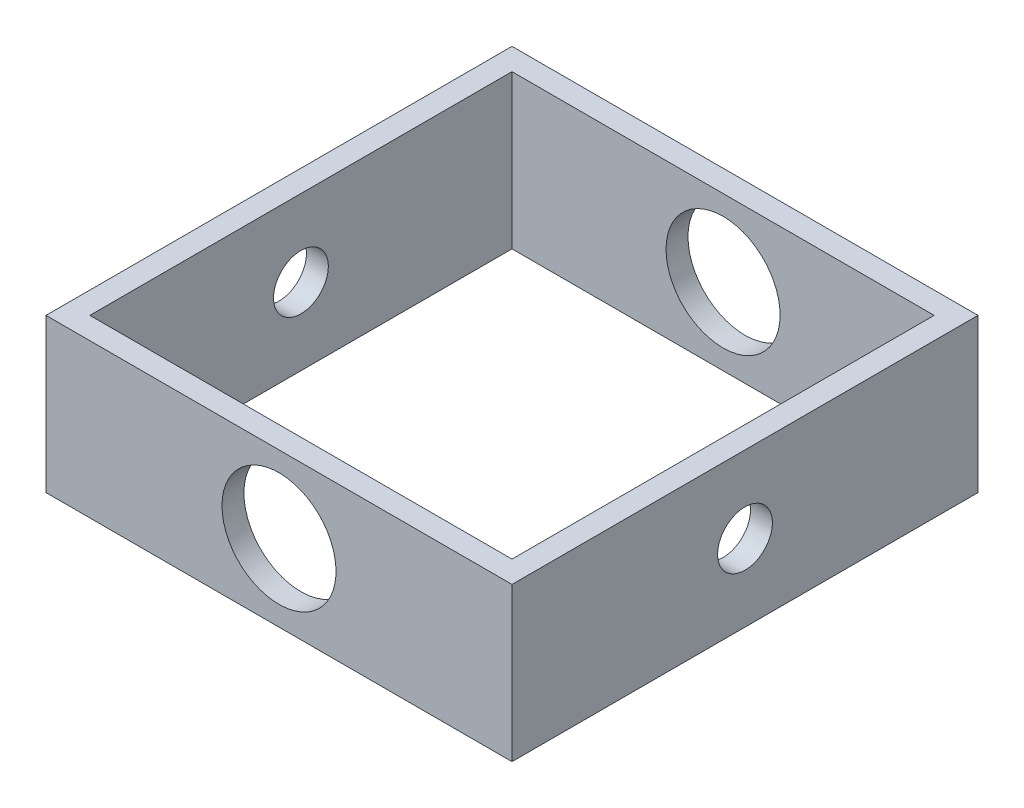
ISO-10303-21;
HEADER;
FILE_DESCRIPTION(('STEP AP214'),'2;1');
FILE_NAME('part.step','',(''),(''),'','','');
FILE_SCHEMA(('AUTOMOTIVE_DESIGN { 1 0 10303 214 1 1 1 1 }'));
ENDSEC;
DATA;
#1=APPLICATION_CONTEXT('core data for automotive mechanical design processes');
#2=APPLICATION_PROTOCOL_DEFINITION('international standard','automotive_design',2000,#1);
#3=PRODUCT_CONTEXT('',#1,'mechanical');
#4=PRODUCT('Part','Part','',(#3));
#5=PRODUCT_RELATED_PRODUCT_CATEGORY('part','',(#4));
#6=PRODUCT_DEFINITION_FORMATION('','',#4);
#7=PRODUCT_DEFINITION_CONTEXT('part definition',#1,'design');
#8=PRODUCT_DEFINITION('design','',#6,#7);
#9=PRODUCT_DEFINITION_SHAPE('','',#8);
#10=(LENGTH_UNIT() NAMED_UNIT(*) SI_UNIT(.MILLI.,.METRE.));
#11=(NAMED_UNIT(*) PLANE_ANGLE_UNIT() SI_UNIT($,.RADIAN.));
#12=(NAMED_UNIT(*) SI_UNIT($,.STERADIAN.) SOLID_ANGLE_UNIT());
#13=UNCERTAINTY_MEASURE_WITH_UNIT(LENGTH_MEASURE(1.E-05),#10,'distance_accuracy_value','');
#14=(GEOMETRIC_REPRESENTATION_CONTEXT(3) GLOBAL_UNCERTAINTY_ASSIGNED_CONTEXT((#13)) GLOBAL_UNIT_ASSIGNED_CONTEXT((#10,
#11,#12)) REPRESENTATION_CONTEXT('',''));
#15=CARTESIAN_POINT('',(0.,0.,0.));
#16=DIRECTION('',(0.,0.,1.));
#17=DIRECTION('',(1.,0.,0.));
#18=AXIS2_PLACEMENT_3D('',#15,#16,#17);
#19=CARTESIAN_POINT('',(0.,8.89,0.));
#20=DIRECTION('',(0.,1.,0.));
#21=DIRECTION('',(0.,0.,1.));
#22=AXIS2_PLACEMENT_3D('',#19,#20,#21);
#23=PLANE('',#22);
#24=DIRECTION('',(0.,0.,-1.));
#25=VECTOR('',#24,1.);
#26=CARTESIAN_POINT('',(13.49375,8.89,-13.49375));
#27=LINE('',#26,#25);
#28=CARTESIAN_POINT('',(13.49375,8.89,13.49375));
#29=VERTEX_POINT('',#28);
#30=CARTESIAN_POINT('',(13.49375,8.89,-13.49375));
#31=VERTEX_POINT('',#30);
#32=EDGE_CURVE('E138',#29,#31,#27,.T.);
#33=ORIENTED_EDGE('',*,*,#32,.T.);
#34=DIRECTION('',(-1.,0.,0.));
#35=VECTOR('',#34,1.);
#36=CARTESIAN_POINT('',(-13.49375,8.89,-13.49375));
#37=LINE('',#36,#35);
#38=CARTESIAN_POINT('',(-13.49375,8.89,-13.49375));
#39=VERTEX_POINT('',#38);
#40=EDGE_CURVE('E141',#31,#39,#37,.T.);
#41=ORIENTED_EDGE('',*,*,#40,.T.);
#42=DIRECTION('',(0.,0.,1.));
#43=VECTOR('',#42,1.);
#44=CARTESIAN_POINT('',(-13.49375,8.89,-13.49375));
#45=LINE('',#44,#43);
#46=CARTESIAN_POINT('',(-13.49375,8.89,13.49375));
#47=VERTEX_POINT('',#46);
#48=EDGE_CURVE('E144',#39,#47,#45,.T.);
#49=ORIENTED_EDGE('',*,*,#48,.T.);
#50=DIRECTION('',(1.,0.,0.));
#51=VECTOR('',#50,1.);
#52=CARTESIAN_POINT('',(-13.49375,8.89,13.49375));
#53=LINE('',#52,#51);
#54=EDGE_CURVE('E146',#47,#29,#53,.T.);
#55=ORIENTED_EDGE('',*,*,#54,.T.);
#56=EDGE_LOOP('',(#33,#41,#49,#55));
#57=FACE_BOUND('',#56,.T.);
#58=DIRECTION('',(-1.,0.,0.));
#59=VECTOR('',#58,1.);
#60=CARTESIAN_POINT('',(-12.22375,8.89,-12.22375));
#61=LINE('',#60,#59);
#62=CARTESIAN_POINT('',(12.22375,8.89,-12.22375));
#63=VERTEX_POINT('',#62);
#64=CARTESIAN_POINT('',(-12.22375,8.89,-12.22375));
#65=VERTEX_POINT('',#64);
#66=EDGE_CURVE('E108',#63,#65,#61,.T.);
#67=ORIENTED_EDGE('',*,*,#66,.F.);
#68=DIRECTION('',(0.,0.,-1.));
#69=VECTOR('',#68,1.);
#70=CARTESIAN_POINT('',(12.22375,8.89,-12.22375));
#71=LINE('',#70,#69);
#72=CARTESIAN_POINT('',(12.22375,8.89,12.22375));
#73=VERTEX_POINT('',#72);
#74=EDGE_CURVE('E100',#73,#63,#71,.T.);
#75=ORIENTED_EDGE('',*,*,#74,.F.);
#76=DIRECTION('',(1.,0.,0.));
#77=VECTOR('',#76,1.);
#78=CARTESIAN_POINT('',(-12.22375,8.89,12.22375));
#79=LINE('',#78,#77);
#80=CARTESIAN_POINT('',(-12.22375,8.89,12.22375));
#81=VERTEX_POINT('',#80);
#82=EDGE_CURVE('E122',#81,#73,#79,.T.);
#83=ORIENTED_EDGE('',*,*,#82,.F.);
#84=DIRECTION('',(0.,0.,1.));
#85=VECTOR('',#84,1.);
#86=CARTESIAN_POINT('',(-12.22375,8.89,-12.22375));
#87=LINE('',#86,#85);
#88=EDGE_CURVE('E120',#65,#81,#87,.T.);
#89=ORIENTED_EDGE('',*,*,#88,.F.);
#90=EDGE_LOOP('',(#67,#75,#83,#89));
#91=FACE_BOUND('',#90,.T.);
#92=ADVANCED_FACE('F33',(#57,#91),#23,.T.);
#93=CARTESIAN_POINT('',(0.,0.,0.));
#94=DIRECTION('',(0.,1.,0.));
#95=DIRECTION('',(0.,0.,1.));
#96=AXIS2_PLACEMENT_3D('',#93,#94,#95);
#97=PLANE('',#96);
#98=DIRECTION('',(0.,0.,-1.));
#99=VECTOR('',#98,1.);
#100=CARTESIAN_POINT('',(13.49375,0.,-13.49375));
#101=LINE('',#100,#99);
#102=CARTESIAN_POINT('',(13.49375,0.,13.49375));
#103=VERTEX_POINT('',#102);
#104=CARTESIAN_POINT('',(13.49375,0.,-13.49375));
#105=VERTEX_POINT('',#104);
#106=EDGE_CURVE('E116',#103,#105,#101,.T.);
#107=ORIENTED_EDGE('',*,*,#106,.F.);
#108=DIRECTION('',(1.,0.,0.));
#109=VECTOR('',#108,1.);
#110=CARTESIAN_POINT('',(-13.49375,0.,13.49375));
#111=LINE('',#110,#109);
#112=CARTESIAN_POINT('',(-13.49375,0.,13.49375));
#113=VERTEX_POINT('',#112);
#114=EDGE_CURVE('E142',#113,#103,#111,.T.);
#115=ORIENTED_EDGE('',*,*,#114,.F.);
#116=DIRECTION('',(0.,0.,1.));
#117=VECTOR('',#116,1.);
#118=CARTESIAN_POINT('',(-13.49375,0.,-13.49375));
#119=LINE('',#118,#117);
#120=CARTESIAN_POINT('',(-13.49375,0.,-13.49375));
#121=VERTEX_POINT('',#120);
#122=EDGE_CURVE('E153',#121,#113,#119,.T.);
#123=ORIENTED_EDGE('',*,*,#122,.F.);
#124=DIRECTION('',(-1.,0.,0.));
#125=VECTOR('',#124,1.);
#126=CARTESIAN_POINT('',(-13.49375,0.,-13.49375));
#127=LINE('',#126,#125);
#128=EDGE_CURVE('E151',#105,#121,#127,.T.);
#129=ORIENTED_EDGE('',*,*,#128,.F.);
#130=EDGE_LOOP('',(#107,#115,#123,#129));
#131=FACE_BOUND('',#130,.T.);
#132=DIRECTION('',(0.,0.,-1.));
#133=VECTOR('',#132,1.);
#134=CARTESIAN_POINT('',(12.22375,0.,-12.22375));
#135=LINE('',#134,#133);
#136=CARTESIAN_POINT('',(12.22375,0.,12.22375));
#137=VERTEX_POINT('',#136);
#138=CARTESIAN_POINT('',(12.22375,0.,-12.22375));
#139=VERTEX_POINT('',#138);
#140=EDGE_CURVE('E58',#137,#139,#135,.T.);
#141=ORIENTED_EDGE('',*,*,#140,.T.);
#142=DIRECTION('',(-1.,0.,0.));
#143=VECTOR('',#142,1.);
#144=CARTESIAN_POINT('',(-12.22375,0.,-12.22375));
#145=LINE('',#144,#143);
#146=CARTESIAN_POINT('',(-12.22375,0.,-12.22375));
#147=VERTEX_POINT('',#146);
#148=EDGE_CURVE('E115',#139,#147,#145,.T.);
#149=ORIENTED_EDGE('',*,*,#148,.T.);
#150=DIRECTION('',(0.,0.,1.));
#151=VECTOR('',#150,1.);
#152=CARTESIAN_POINT('',(-12.22375,0.,-12.22375));
#153=LINE('',#152,#151);
#154=CARTESIAN_POINT('',(-12.22375,0.,12.22375));
#155=VERTEX_POINT('',#154);
#156=EDGE_CURVE('E130',#147,#155,#153,.T.);
#157=ORIENTED_EDGE('',*,*,#156,.T.);
#158=DIRECTION('',(1.,0.,0.));
#159=VECTOR('',#158,1.);
#160=CARTESIAN_POINT('',(-12.22375,0.,12.22375));
#161=LINE('',#160,#159);
#162=EDGE_CURVE('E109',#155,#137,#161,.T.);
#163=ORIENTED_EDGE('',*,*,#162,.T.);
#164=EDGE_LOOP('',(#141,#149,#157,#163));
#165=FACE_BOUND('',#164,.T.);
#166=ADVANCED_FACE('F201',(#131,#165),#97,.F.);
#167=CARTESIAN_POINT('',(13.49375,8.89,-13.49375));
#168=DIRECTION('',(-1.,0.,0.));
#169=DIRECTION('',(0.,0.,1.));
#170=AXIS2_PLACEMENT_3D('',#167,#168,#169);
#171=PLANE('',#170);
#172=CARTESIAN_POINT('',(13.49375,4.445,0.));
#173=DIRECTION('',(1.,0.,0.));
#174=DIRECTION('',(0.,0.,-1.));
#175=AXIS2_PLACEMENT_3D('',#172,#173,#174);
#176=CIRCLE('',#175,1.5875);
#177=CARTESIAN_POINT('',(13.49375,4.445,-1.5875));
#178=VERTEX_POINT('',#177);
#179=EDGE_CURVE('E165',#178,#178,#176,.T.);
#180=ORIENTED_EDGE('',*,*,#179,.F.);
#181=EDGE_LOOP('',(#180));
#182=FACE_BOUND('',#181,.T.);
#183=ORIENTED_EDGE('',*,*,#106,.T.);
#184=DIRECTION('',(0.,-1.,0.));
#185=VECTOR('',#184,1.);
#186=CARTESIAN_POINT('',(13.49375,8.89,-13.49375));
#187=LINE('',#186,#185);
#188=EDGE_CURVE('E11',#31,#105,#187,.T.);
#189=ORIENTED_EDGE('',*,*,#188,.F.);
#190=ORIENTED_EDGE('',*,*,#32,.F.);
#191=DIRECTION('',(0.,-1.,0.));
#192=VECTOR('',#191,1.);
#193=CARTESIAN_POINT('',(13.49375,8.89,13.49375));
#194=LINE('',#193,#192);
#195=EDGE_CURVE('E148',#29,#103,#194,.T.);
#196=ORIENTED_EDGE('',*,*,#195,.T.);
#197=EDGE_LOOP('',(#183,#189,#190,#196));
#198=FACE_BOUND('',#197,.T.);
#199=ADVANCED_FACE('F35',(#182,#198),#171,.F.);
#200=CARTESIAN_POINT('',(-13.49375,8.89,-13.49375));
#201=DIRECTION('',(0.,0.,1.));
#202=DIRECTION('',(1.,0.,0.));
#203=AXIS2_PLACEMENT_3D('',#200,#201,#202);
#204=PLANE('',#203);
#205=CARTESIAN_POINT('',(0.,4.445,-13.49375));
#206=DIRECTION('',(0.,0.,-1.));
#207=DIRECTION('',(-1.,0.,0.));
#208=AXIS2_PLACEMENT_3D('',#205,#206,#207);
#209=CIRCLE('',#208,3.302);
#210=CARTESIAN_POINT('',(-3.302,4.445,-13.49375));
#211=VERTEX_POINT('',#210);
#212=EDGE_CURVE('E227',#211,#211,#209,.T.);
#213=ORIENTED_EDGE('',*,*,#212,.F.);
#214=EDGE_LOOP('',(#213));
#215=FACE_BOUND('',#214,.T.);
#216=ORIENTED_EDGE('',*,*,#128,.T.);
#217=DIRECTION('',(0.,-1.,0.));
#218=VECTOR('',#217,1.);
#219=CARTESIAN_POINT('',(-13.49375,8.89,-13.49375));
#220=LINE('',#219,#218);
#221=EDGE_CURVE('E42',#39,#121,#220,.T.);
#222=ORIENTED_EDGE('',*,*,#221,.F.);
#223=ORIENTED_EDGE('',*,*,#40,.F.);
#224=ORIENTED_EDGE('',*,*,#188,.T.);
#225=EDGE_LOOP('',(#216,#222,#223,#224));
#226=FACE_BOUND('',#225,.T.);
#227=ADVANCED_FACE('F217',(#215,#226),#204,.F.);
#228=CARTESIAN_POINT('',(-13.49375,8.89,-13.49375));
#229=DIRECTION('',(1.,0.,0.));
#230=DIRECTION('',(0.,0.,-1.));
#231=AXIS2_PLACEMENT_3D('',#228,#229,#230);
#232=PLANE('',#231);
#233=CARTESIAN_POINT('',(-13.49375,4.445,0.));
#234=DIRECTION('',(1.,0.,0.));
#235=DIRECTION('',(0.,0.,-1.));
#236=AXIS2_PLACEMENT_3D('',#233,#234,#235);
#237=CIRCLE('',#236,1.5875);
#238=CARTESIAN_POINT('',(-13.49375,4.445,-1.5875));
#239=VERTEX_POINT('',#238);
#240=EDGE_CURVE('E128',#239,#239,#237,.T.);
#241=ORIENTED_EDGE('',*,*,#240,.T.);
#242=EDGE_LOOP('',(#241));
#243=FACE_BOUND('',#242,.T.);
#244=ORIENTED_EDGE('',*,*,#122,.T.);
#245=DIRECTION('',(0.,-1.,0.));
#246=VECTOR('',#245,1.);
#247=CARTESIAN_POINT('',(-13.49375,8.89,13.49375));
#248=LINE('',#247,#246);
#249=EDGE_CURVE('E158',#47,#113,#248,.T.);
#250=ORIENTED_EDGE('',*,*,#249,.F.);
#251=ORIENTED_EDGE('',*,*,#48,.F.);
#252=ORIENTED_EDGE('',*,*,#221,.T.);
#253=EDGE_LOOP('',(#244,#250,#251,#252));
#254=FACE_BOUND('',#253,.T.);
#255=ADVANCED_FACE('F182',(#243,#254),#232,.F.);
#256=CARTESIAN_POINT('',(-13.49375,8.89,13.49375));
#257=DIRECTION('',(0.,0.,-1.));
#258=DIRECTION('',(-1.,0.,0.));
#259=AXIS2_PLACEMENT_3D('',#256,#257,#258);
#260=PLANE('',#259);
#261=CARTESIAN_POINT('',(0.,4.445,13.49375));
#262=DIRECTION('',(0.,0.,-1.));
#263=DIRECTION('',(-1.,0.,0.));
#264=AXIS2_PLACEMENT_3D('',#261,#262,#263);
#265=CIRCLE('',#264,3.302);
#266=CARTESIAN_POINT('',(-3.302,4.445,13.49375));
#267=VERTEX_POINT('',#266);
#268=EDGE_CURVE('E171',#267,#267,#265,.T.);
#269=ORIENTED_EDGE('',*,*,#268,.T.);
#270=EDGE_LOOP('',(#269));
#271=FACE_BOUND('',#270,.T.);
#272=ORIENTED_EDGE('',*,*,#114,.T.);
#273=ORIENTED_EDGE('',*,*,#195,.F.);
#274=ORIENTED_EDGE('',*,*,#54,.F.);
#275=ORIENTED_EDGE('',*,*,#249,.T.);
#276=EDGE_LOOP('',(#272,#273,#274,#275));
#277=FACE_BOUND('',#276,.T.);
#278=ADVANCED_FACE('F212',(#271,#277),#260,.F.);
#279=CARTESIAN_POINT('',(12.22375,8.89,-12.22375));
#280=DIRECTION('',(-1.,0.,0.));
#281=DIRECTION('',(0.,0.,1.));
#282=AXIS2_PLACEMENT_3D('',#279,#280,#281);
#283=PLANE('',#282);
#284=CARTESIAN_POINT('',(12.22375,4.445,0.));
#285=DIRECTION('',(-1.,0.,0.));
#286=DIRECTION('',(0.,0.,1.));
#287=AXIS2_PLACEMENT_3D('',#284,#285,#286);
#288=CIRCLE('',#287,1.5875);
#289=CARTESIAN_POINT('',(12.22375,4.445,1.5875));
#290=VERTEX_POINT('',#289);
#291=EDGE_CURVE('E164',#290,#290,#288,.T.);
#292=ORIENTED_EDGE('',*,*,#291,.F.);
#293=EDGE_LOOP('',(#292));
#294=FACE_BOUND('',#293,.T.);
#295=ORIENTED_EDGE('',*,*,#140,.F.);
#296=DIRECTION('',(0.,-1.,0.));
#297=VECTOR('',#296,1.);
#298=CARTESIAN_POINT('',(12.22375,8.89,12.22375));
#299=LINE('',#298,#297);
#300=EDGE_CURVE('E104',#73,#137,#299,.T.);
#301=ORIENTED_EDGE('',*,*,#300,.F.);
#302=ORIENTED_EDGE('',*,*,#74,.T.);
#303=DIRECTION('',(0.,-1.,0.));
#304=VECTOR('',#303,1.);
#305=CARTESIAN_POINT('',(12.22375,8.89,-12.22375));
#306=LINE('',#305,#304);
#307=EDGE_CURVE('E103',#63,#139,#306,.T.);
#308=ORIENTED_EDGE('',*,*,#307,.T.);
#309=EDGE_LOOP('',(#295,#301,#302,#308));
#310=FACE_BOUND('',#309,.T.);
#311=ADVANCED_FACE('F102',(#294,#310),#283,.T.);
#312=CARTESIAN_POINT('',(-12.22375,8.89,-12.22375));
#313=DIRECTION('',(0.,0.,1.));
#314=DIRECTION('',(1.,0.,0.));
#315=AXIS2_PLACEMENT_3D('',#312,#313,#314);
#316=PLANE('',#315);
#317=CARTESIAN_POINT('',(0.,4.445,-12.22375));
#318=DIRECTION('',(0.,0.,1.));
#319=DIRECTION('',(1.,0.,0.));
#320=AXIS2_PLACEMENT_3D('',#317,#318,#319);
#321=CIRCLE('',#320,3.302);
#322=CARTESIAN_POINT('',(3.302,4.445,-12.22375));
#323=VERTEX_POINT('',#322);
#324=EDGE_CURVE('E176',#323,#323,#321,.T.);
#325=ORIENTED_EDGE('',*,*,#324,.F.);
#326=EDGE_LOOP('',(#325));
#327=FACE_BOUND('',#326,.T.);
#328=ORIENTED_EDGE('',*,*,#148,.F.);
#329=ORIENTED_EDGE('',*,*,#307,.F.);
#330=ORIENTED_EDGE('',*,*,#66,.T.);
#331=DIRECTION('',(0.,-1.,0.));
#332=VECTOR('',#331,1.);
#333=CARTESIAN_POINT('',(-12.22375,8.89,-12.22375));
#334=LINE('',#333,#332);
#335=EDGE_CURVE('E117',#65,#147,#334,.T.);
#336=ORIENTED_EDGE('',*,*,#335,.T.);
#337=EDGE_LOOP('',(#328,#329,#330,#336));
#338=FACE_BOUND('',#337,.T.);
#339=ADVANCED_FACE('F112',(#327,#338),#316,.T.);
#340=CARTESIAN_POINT('',(-12.22375,8.89,-12.22375));
#341=DIRECTION('',(1.,0.,0.));
#342=DIRECTION('',(0.,0.,-1.));
#343=AXIS2_PLACEMENT_3D('',#340,#341,#342);
#344=PLANE('',#343);
#345=CARTESIAN_POINT('',(-12.22375,4.445,0.));
#346=DIRECTION('',(1.,0.,0.));
#347=DIRECTION('',(0.,0.,-1.));
#348=AXIS2_PLACEMENT_3D('',#345,#346,#347);
#349=CIRCLE('',#348,1.5875);
#350=CARTESIAN_POINT('',(-12.22375,4.445,-1.5875));
#351=VERTEX_POINT('',#350);
#352=EDGE_CURVE('E162',#351,#351,#349,.T.);
#353=ORIENTED_EDGE('',*,*,#352,.F.);
#354=EDGE_LOOP('',(#353));
#355=FACE_BOUND('',#354,.T.);
#356=ORIENTED_EDGE('',*,*,#156,.F.);
#357=ORIENTED_EDGE('',*,*,#335,.F.);
#358=ORIENTED_EDGE('',*,*,#88,.T.);
#359=DIRECTION('',(0.,-1.,0.));
#360=VECTOR('',#359,1.);
#361=CARTESIAN_POINT('',(-12.22375,8.89,12.22375));
#362=LINE('',#361,#360);
#363=EDGE_CURVE('E50',#81,#155,#362,.T.);
#364=ORIENTED_EDGE('',*,*,#363,.T.);
#365=EDGE_LOOP('',(#356,#357,#358,#364));
#366=FACE_BOUND('',#365,.T.);
#367=ADVANCED_FACE('F196',(#355,#366),#344,.T.);
#368=CARTESIAN_POINT('',(-12.22375,8.89,12.22375));
#369=DIRECTION('',(0.,0.,-1.));
#370=DIRECTION('',(-1.,0.,0.));
#371=AXIS2_PLACEMENT_3D('',#368,#369,#370);
#372=PLANE('',#371);
#373=CARTESIAN_POINT('',(0.,4.445,12.22375));
#374=DIRECTION('',(0.,0.,-1.));
#375=DIRECTION('',(-1.,0.,0.));
#376=AXIS2_PLACEMENT_3D('',#373,#374,#375);
#377=CIRCLE('',#376,3.302);
#378=CARTESIAN_POINT('',(-3.302,4.445,12.22375));
#379=VERTEX_POINT('',#378);
#380=EDGE_CURVE('E37',#379,#379,#377,.T.);
#381=ORIENTED_EDGE('',*,*,#380,.F.);
#382=EDGE_LOOP('',(#381));
#383=FACE_BOUND('',#382,.T.);
#384=ORIENTED_EDGE('',*,*,#162,.F.);
#385=ORIENTED_EDGE('',*,*,#363,.F.);
#386=ORIENTED_EDGE('',*,*,#82,.T.);
#387=ORIENTED_EDGE('',*,*,#300,.T.);
#388=EDGE_LOOP('',(#384,#385,#386,#387));
#389=FACE_BOUND('',#388,.T.);
#390=ADVANCED_FACE('F188',(#383,#389),#372,.T.);
#391=CARTESIAN_POINT('',(-138.90625,4.445,0.));
#392=DIRECTION('',(1.,0.,0.));
#393=DIRECTION('',(0.,0.,-1.));
#394=AXIS2_PLACEMENT_3D('',#391,#392,#393);
#395=CYLINDRICAL_SURFACE('',#394,1.5875);
#396=ORIENTED_EDGE('',*,*,#352,.T.);
#397=EDGE_LOOP('',(#396));
#398=FACE_BOUND('',#397,.T.);
#399=ORIENTED_EDGE('',*,*,#240,.F.);
#400=EDGE_LOOP('',(#399));
#401=FACE_BOUND('',#400,.T.);
#402=ADVANCED_FACE('F185',(#398,#401),#395,.F.);
#403=ORIENTED_EDGE('',*,*,#291,.T.);
#404=EDGE_LOOP('',(#403));
#405=FACE_BOUND('',#404,.T.);
#406=ORIENTED_EDGE('',*,*,#179,.T.);
#407=EDGE_LOOP('',(#406));
#408=FACE_BOUND('',#407,.T.);
#409=ADVANCED_FACE('F187',(#405,#408),#395,.F.);
#410=CARTESIAN_POINT('',(0.,4.445,138.90625));
#411=DIRECTION('',(0.,0.,-1.));
#412=DIRECTION('',(-1.,0.,0.));
#413=AXIS2_PLACEMENT_3D('',#410,#411,#412);
#414=CYLINDRICAL_SURFACE('',#413,3.302);
#415=ORIENTED_EDGE('',*,*,#380,.T.);
#416=EDGE_LOOP('',(#415));
#417=FACE_BOUND('',#416,.T.);
#418=ORIENTED_EDGE('',*,*,#268,.F.);
#419=EDGE_LOOP('',(#418));
#420=FACE_BOUND('',#419,.T.);
#421=ADVANCED_FACE('F194',(#417,#420),#414,.F.);
#422=ORIENTED_EDGE('',*,*,#324,.T.);
#423=EDGE_LOOP('',(#422));
#424=FACE_BOUND('',#423,.T.);
#425=ORIENTED_EDGE('',*,*,#212,.T.);
#426=EDGE_LOOP('',(#425));
#427=FACE_BOUND('',#426,.T.);
#428=ADVANCED_FACE('F260',(#424,#427),#414,.F.);
#429=CLOSED_SHELL('',(#92,#166,#199,#227,#255,#278,#311,#339,#367,#390,#402,#409,#421,#428));
#430=MANIFOLD_SOLID_BREP('B2',#429);
#431=ADVANCED_BREP_SHAPE_REPRESENTATION('',(#18,#430),#14);
#432=SHAPE_DEFINITION_REPRESENTATION(#9,#431);
ENDSEC;
END-ISO-10303-21;
